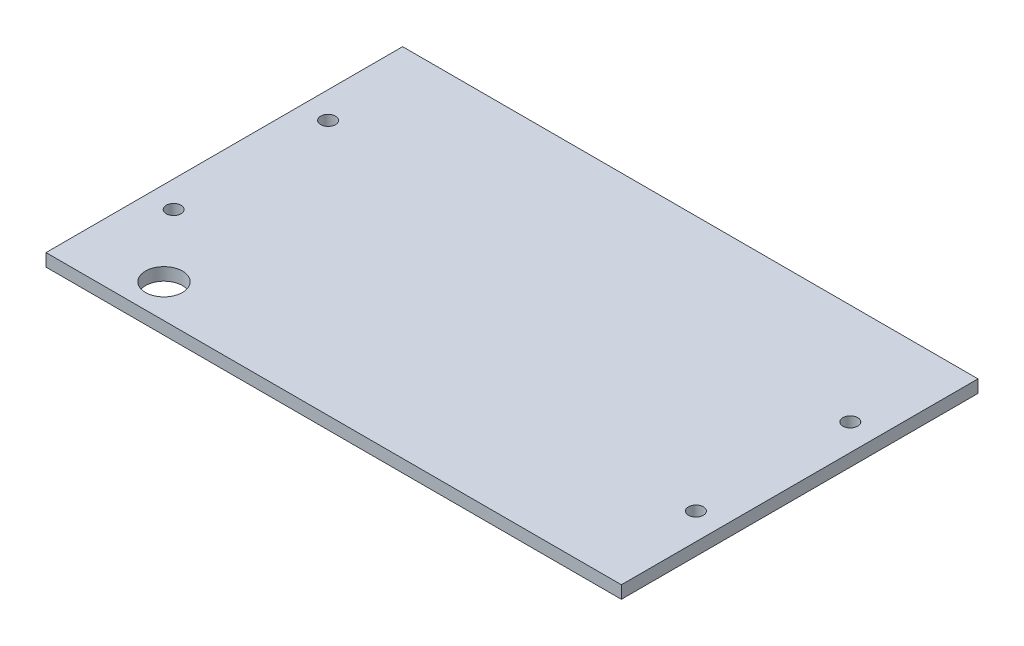
ISO-10303-21;
HEADER;
FILE_DESCRIPTION(('STEP AP214'),'2;1');
FILE_NAME('part.step','',(''),(''),'','','');
FILE_SCHEMA(('AUTOMOTIVE_DESIGN { 1 0 10303 214 1 1 1 1 }'));
ENDSEC;
DATA;
#1=APPLICATION_CONTEXT('core data for automotive mechanical design processes');
#2=APPLICATION_PROTOCOL_DEFINITION('international standard','automotive_design',2000,#1);
#3=PRODUCT_CONTEXT('',#1,'mechanical');
#4=PRODUCT('Part','Part','',(#3));
#5=PRODUCT_RELATED_PRODUCT_CATEGORY('part','',(#4));
#6=PRODUCT_DEFINITION_FORMATION('','',#4);
#7=PRODUCT_DEFINITION_CONTEXT('part definition',#1,'design');
#8=PRODUCT_DEFINITION('design','',#6,#7);
#9=PRODUCT_DEFINITION_SHAPE('','',#8);
#10=(LENGTH_UNIT() NAMED_UNIT(*) SI_UNIT(.MILLI.,.METRE.));
#11=(NAMED_UNIT(*) PLANE_ANGLE_UNIT() SI_UNIT($,.RADIAN.));
#12=(NAMED_UNIT(*) SI_UNIT($,.STERADIAN.) SOLID_ANGLE_UNIT());
#13=UNCERTAINTY_MEASURE_WITH_UNIT(LENGTH_MEASURE(1.E-05),#10,'distance_accuracy_value','');
#14=(GEOMETRIC_REPRESENTATION_CONTEXT(3) GLOBAL_UNCERTAINTY_ASSIGNED_CONTEXT((#13)) GLOBAL_UNIT_ASSIGNED_CONTEXT((#10,
#11,#12)) REPRESENTATION_CONTEXT('',''));
#15=CARTESIAN_POINT('',(0.,0.,0.));
#16=DIRECTION('',(0.,0.,1.));
#17=DIRECTION('',(1.,0.,0.));
#18=AXIS2_PLACEMENT_3D('',#15,#16,#17);
#19=CARTESIAN_POINT('',(0.,4.7625,0.));
#20=DIRECTION('',(0.,-1.,0.));
#21=DIRECTION('',(0.,0.,-1.));
#22=AXIS2_PLACEMENT_3D('',#19,#20,#21);
#23=PLANE('',#22);
#24=DIRECTION('',(0.,0.,1.));
#25=VECTOR('',#24,1.);
#26=CARTESIAN_POINT('',(0.,4.7625,0.));
#27=LINE('',#26,#25);
#28=CARTESIAN_POINT('',(0.,4.7625,-134.366));
#29=VERTEX_POINT('',#28);
#30=CARTESIAN_POINT('',(0.,4.7625,0.));
#31=VERTEX_POINT('',#30);
#32=EDGE_CURVE('E88',#29,#31,#27,.T.);
#33=ORIENTED_EDGE('',*,*,#32,.T.);
#34=DIRECTION('',(1.,0.,0.));
#35=VECTOR('',#34,1.);
#36=CARTESIAN_POINT('',(0.,4.7625,0.));
#37=LINE('',#36,#35);
#38=CARTESIAN_POINT('',(216.78392,4.7625,0.));
#39=VERTEX_POINT('',#38);
#40=EDGE_CURVE('E83',#31,#39,#37,.T.);
#41=ORIENTED_EDGE('',*,*,#40,.T.);
#42=DIRECTION('',(0.,0.,-1.));
#43=VECTOR('',#42,1.);
#44=CARTESIAN_POINT('',(216.78392,4.7625,0.));
#45=LINE('',#44,#43);
#46=CARTESIAN_POINT('',(216.78392,4.7625,-134.366));
#47=VERTEX_POINT('',#46);
#48=EDGE_CURVE('E86',#39,#47,#45,.T.);
#49=ORIENTED_EDGE('',*,*,#48,.T.);
#50=DIRECTION('',(-1.,0.,0.));
#51=VECTOR('',#50,1.);
#52=CARTESIAN_POINT('',(0.,4.7625,-134.366));
#53=LINE('',#52,#51);
#54=EDGE_CURVE('E53',#47,#29,#53,.T.);
#55=ORIENTED_EDGE('',*,*,#54,.T.);
#56=EDGE_LOOP('',(#33,#41,#49,#55));
#57=FACE_BOUND('',#56,.T.);
#58=CARTESIAN_POINT('',(31.75,4.7625,-12.7));
#59=DIRECTION('',(0.,1.,0.));
#60=DIRECTION('',(0.,0.,1.));
#61=AXIS2_PLACEMENT_3D('',#58,#59,#60);
#62=CIRCLE('',#61,6.985);
#63=CARTESIAN_POINT('',(31.75,4.7625,-19.685));
#64=VERTEX_POINT('',#63);
#65=EDGE_CURVE('E103',#64,#64,#62,.T.);
#66=ORIENTED_EDGE('',*,*,#65,.F.);
#67=EDGE_LOOP('',(#66));
#68=FACE_BOUND('',#67,.T.);
#69=CARTESIAN_POINT('',(10.0076,4.7625,-96.266));
#70=DIRECTION('',(0.,1.,0.));
#71=DIRECTION('',(0.,0.,1.));
#72=AXIS2_PLACEMENT_3D('',#69,#70,#71);
#73=CIRCLE('',#72,2.794);
#74=CARTESIAN_POINT('',(10.0076,4.7625,-99.06));
#75=VERTEX_POINT('',#74);
#76=EDGE_CURVE('E118',#75,#75,#73,.T.);
#77=ORIENTED_EDGE('',*,*,#76,.F.);
#78=EDGE_LOOP('',(#77));
#79=FACE_BOUND('',#78,.T.);
#80=CARTESIAN_POINT('',(10.0076,4.7625,-38.1));
#81=DIRECTION('',(0.,1.,0.));
#82=DIRECTION('',(0.,0.,1.));
#83=AXIS2_PLACEMENT_3D('',#80,#81,#82);
#84=CIRCLE('',#83,2.794);
#85=CARTESIAN_POINT('',(10.0076,4.7625,-40.894));
#86=VERTEX_POINT('',#85);
#87=EDGE_CURVE('E124',#86,#86,#84,.T.);
#88=ORIENTED_EDGE('',*,*,#87,.F.);
#89=EDGE_LOOP('',(#88));
#90=FACE_BOUND('',#89,.T.);
#91=CARTESIAN_POINT('',(206.77632,4.7625,-96.266));
#92=DIRECTION('',(0.,1.,0.));
#93=DIRECTION('',(0.,0.,1.));
#94=AXIS2_PLACEMENT_3D('',#91,#92,#93);
#95=CIRCLE('',#94,2.79399999999998);
#96=CARTESIAN_POINT('',(206.77632,4.7625,-99.06));
#97=VERTEX_POINT('',#96);
#98=EDGE_CURVE('E130',#97,#97,#95,.T.);
#99=ORIENTED_EDGE('',*,*,#98,.F.);
#100=EDGE_LOOP('',(#99));
#101=FACE_BOUND('',#100,.T.);
#102=CARTESIAN_POINT('',(206.77632,4.7625,-38.1));
#103=DIRECTION('',(0.,1.,0.));
#104=DIRECTION('',(0.,0.,1.));
#105=AXIS2_PLACEMENT_3D('',#102,#103,#104);
#106=CIRCLE('',#105,2.79399999999998);
#107=CARTESIAN_POINT('',(206.77632,4.7625,-40.894));
#108=VERTEX_POINT('',#107);
#109=EDGE_CURVE('E136',#108,#108,#106,.T.);
#110=ORIENTED_EDGE('',*,*,#109,.F.);
#111=EDGE_LOOP('',(#110));
#112=FACE_BOUND('',#111,.T.);
#113=ADVANCED_FACE('F36',(#57,#68,#79,#90,#101,#112),#23,.F.);
#114=CARTESIAN_POINT('',(0.,0.,0.));
#115=DIRECTION('',(0.,-1.,0.));
#116=DIRECTION('',(0.,0.,-1.));
#117=AXIS2_PLACEMENT_3D('',#114,#115,#116);
#118=PLANE('',#117);
#119=CARTESIAN_POINT('',(206.77632,0.,-96.266));
#120=DIRECTION('',(0.,1.,0.));
#121=DIRECTION('',(0.,0.,1.));
#122=AXIS2_PLACEMENT_3D('',#119,#120,#121);
#123=CIRCLE('',#122,2.79399999999998);
#124=CARTESIAN_POINT('',(206.77632,0.,-99.06));
#125=VERTEX_POINT('',#124);
#126=EDGE_CURVE('E133',#125,#125,#123,.T.);
#127=ORIENTED_EDGE('',*,*,#126,.T.);
#128=EDGE_LOOP('',(#127));
#129=FACE_BOUND('',#128,.T.);
#130=CARTESIAN_POINT('',(10.0076,0.,-96.266));
#131=DIRECTION('',(0.,1.,0.));
#132=DIRECTION('',(0.,0.,1.));
#133=AXIS2_PLACEMENT_3D('',#130,#131,#132);
#134=CIRCLE('',#133,2.794);
#135=CARTESIAN_POINT('',(10.0076,0.,-99.06));
#136=VERTEX_POINT('',#135);
#137=EDGE_CURVE('E121',#136,#136,#134,.T.);
#138=ORIENTED_EDGE('',*,*,#137,.T.);
#139=EDGE_LOOP('',(#138));
#140=FACE_BOUND('',#139,.T.);
#141=DIRECTION('',(0.,0.,1.));
#142=VECTOR('',#141,1.);
#143=CARTESIAN_POINT('',(0.,0.,0.));
#144=LINE('',#143,#142);
#145=CARTESIAN_POINT('',(0.,0.,-134.366));
#146=VERTEX_POINT('',#145);
#147=CARTESIAN_POINT('',(0.,0.,0.));
#148=VERTEX_POINT('',#147);
#149=EDGE_CURVE('E100',#146,#148,#144,.T.);
#150=ORIENTED_EDGE('',*,*,#149,.F.);
#151=DIRECTION('',(-1.,0.,0.));
#152=VECTOR('',#151,1.);
#153=CARTESIAN_POINT('',(0.,0.,-134.366));
#154=LINE('',#153,#152);
#155=CARTESIAN_POINT('',(216.78392,0.,-134.366));
#156=VERTEX_POINT('',#155);
#157=EDGE_CURVE('E76',#156,#146,#154,.T.);
#158=ORIENTED_EDGE('',*,*,#157,.F.);
#159=DIRECTION('',(0.,0.,-1.));
#160=VECTOR('',#159,1.);
#161=CARTESIAN_POINT('',(216.78392,0.,0.));
#162=LINE('',#161,#160);
#163=CARTESIAN_POINT('',(216.78392,0.,0.));
#164=VERTEX_POINT('',#163);
#165=EDGE_CURVE('E70',#164,#156,#162,.T.);
#166=ORIENTED_EDGE('',*,*,#165,.F.);
#167=DIRECTION('',(1.,0.,0.));
#168=VECTOR('',#167,1.);
#169=CARTESIAN_POINT('',(0.,0.,0.));
#170=LINE('',#169,#168);
#171=EDGE_CURVE('E92',#148,#164,#170,.T.);
#172=ORIENTED_EDGE('',*,*,#171,.F.);
#173=EDGE_LOOP('',(#150,#158,#166,#172));
#174=FACE_BOUND('',#173,.T.);
#175=CARTESIAN_POINT('',(31.75,0.,-12.7));
#176=DIRECTION('',(0.,1.,0.));
#177=DIRECTION('',(0.,0.,1.));
#178=AXIS2_PLACEMENT_3D('',#175,#176,#177);
#179=CIRCLE('',#178,6.985);
#180=CARTESIAN_POINT('',(31.75,0.,-19.685));
#181=VERTEX_POINT('',#180);
#182=EDGE_CURVE('E115',#181,#181,#179,.T.);
#183=ORIENTED_EDGE('',*,*,#182,.T.);
#184=EDGE_LOOP('',(#183));
#185=FACE_BOUND('',#184,.T.);
#186=CARTESIAN_POINT('',(10.0076,0.,-38.1));
#187=DIRECTION('',(0.,1.,0.));
#188=DIRECTION('',(0.,0.,1.));
#189=AXIS2_PLACEMENT_3D('',#186,#187,#188);
#190=CIRCLE('',#189,2.794);
#191=CARTESIAN_POINT('',(10.0076,0.,-40.894));
#192=VERTEX_POINT('',#191);
#193=EDGE_CURVE('E127',#192,#192,#190,.T.);
#194=ORIENTED_EDGE('',*,*,#193,.T.);
#195=EDGE_LOOP('',(#194));
#196=FACE_BOUND('',#195,.T.);
#197=CARTESIAN_POINT('',(206.77632,0.,-38.1));
#198=DIRECTION('',(0.,1.,0.));
#199=DIRECTION('',(0.,0.,1.));
#200=AXIS2_PLACEMENT_3D('',#197,#198,#199);
#201=CIRCLE('',#200,2.79399999999998);
#202=CARTESIAN_POINT('',(206.77632,0.,-40.894));
#203=VERTEX_POINT('',#202);
#204=EDGE_CURVE('E139',#203,#203,#201,.T.);
#205=ORIENTED_EDGE('',*,*,#204,.T.);
#206=EDGE_LOOP('',(#205));
#207=FACE_BOUND('',#206,.T.);
#208=ADVANCED_FACE('F111',(#129,#140,#174,#185,#196,#207),#118,.T.);
#209=CARTESIAN_POINT('',(0.,4.7625,0.));
#210=DIRECTION('',(1.,0.,0.));
#211=DIRECTION('',(0.,0.,-1.));
#212=AXIS2_PLACEMENT_3D('',#209,#210,#211);
#213=PLANE('',#212);
#214=ORIENTED_EDGE('',*,*,#149,.T.);
#215=DIRECTION('',(0.,-1.,0.));
#216=VECTOR('',#215,1.);
#217=CARTESIAN_POINT('',(0.,4.7625,0.));
#218=LINE('',#217,#216);
#219=EDGE_CURVE('E11',#31,#148,#218,.T.);
#220=ORIENTED_EDGE('',*,*,#219,.F.);
#221=ORIENTED_EDGE('',*,*,#32,.F.);
#222=DIRECTION('',(0.,-1.,0.));
#223=VECTOR('',#222,1.);
#224=CARTESIAN_POINT('',(0.,4.7625,-134.366));
#225=LINE('',#224,#223);
#226=EDGE_CURVE('E96',#29,#146,#225,.T.);
#227=ORIENTED_EDGE('',*,*,#226,.T.);
#228=EDGE_LOOP('',(#214,#220,#221,#227));
#229=FACE_BOUND('',#228,.T.);
#230=ADVANCED_FACE('F38',(#229),#213,.F.);
#231=CARTESIAN_POINT('',(0.,4.7625,0.));
#232=DIRECTION('',(0.,0.,-1.));
#233=DIRECTION('',(-1.,0.,0.));
#234=AXIS2_PLACEMENT_3D('',#231,#232,#233);
#235=PLANE('',#234);
#236=ORIENTED_EDGE('',*,*,#171,.T.);
#237=DIRECTION('',(0.,-1.,0.));
#238=VECTOR('',#237,1.);
#239=CARTESIAN_POINT('',(216.78392,4.7625,0.));
#240=LINE('',#239,#238);
#241=EDGE_CURVE('E45',#39,#164,#240,.T.);
#242=ORIENTED_EDGE('',*,*,#241,.F.);
#243=ORIENTED_EDGE('',*,*,#40,.F.);
#244=ORIENTED_EDGE('',*,*,#219,.T.);
#245=EDGE_LOOP('',(#236,#242,#243,#244));
#246=FACE_BOUND('',#245,.T.);
#247=ADVANCED_FACE('F91',(#246),#235,.F.);
#248=CARTESIAN_POINT('',(216.78392,4.7625,0.));
#249=DIRECTION('',(-1.,0.,0.));
#250=DIRECTION('',(0.,0.,1.));
#251=AXIS2_PLACEMENT_3D('',#248,#249,#250);
#252=PLANE('',#251);
#253=ORIENTED_EDGE('',*,*,#165,.T.);
#254=DIRECTION('',(0.,-1.,0.));
#255=VECTOR('',#254,1.);
#256=CARTESIAN_POINT('',(216.78392,4.7625,-134.366));
#257=LINE('',#256,#255);
#258=EDGE_CURVE('E93',#47,#156,#257,.T.);
#259=ORIENTED_EDGE('',*,*,#258,.F.);
#260=ORIENTED_EDGE('',*,*,#48,.F.);
#261=ORIENTED_EDGE('',*,*,#241,.T.);
#262=EDGE_LOOP('',(#253,#259,#260,#261));
#263=FACE_BOUND('',#262,.T.);
#264=ADVANCED_FACE('F94',(#263),#252,.F.);
#265=CARTESIAN_POINT('',(0.,4.7625,-134.366));
#266=DIRECTION('',(0.,0.,1.));
#267=DIRECTION('',(1.,0.,0.));
#268=AXIS2_PLACEMENT_3D('',#265,#266,#267);
#269=PLANE('',#268);
#270=ORIENTED_EDGE('',*,*,#157,.T.);
#271=ORIENTED_EDGE('',*,*,#226,.F.);
#272=ORIENTED_EDGE('',*,*,#54,.F.);
#273=ORIENTED_EDGE('',*,*,#258,.T.);
#274=EDGE_LOOP('',(#270,#271,#272,#273));
#275=FACE_BOUND('',#274,.T.);
#276=ADVANCED_FACE('F108',(#275),#269,.F.);
#277=CARTESIAN_POINT('',(31.75,4.7625,-12.7));
#278=DIRECTION('',(0.,-1.,0.));
#279=DIRECTION('',(0.,0.,-1.));
#280=AXIS2_PLACEMENT_3D('',#277,#278,#279);
#281=CYLINDRICAL_SURFACE('',#280,6.985);
#282=CARTESIAN_POINT('',(31.75,4.7625,-19.685));
#283=CARTESIAN_POINT('',(31.75,4.712890625,-19.685));
#284=CARTESIAN_POINT('',(31.75,4.66328125,-19.685));
#285=CARTESIAN_POINT('',(31.75,4.5640625,-19.685));
#286=CARTESIAN_POINT('',(31.75,4.514453125,-19.685));
#287=CARTESIAN_POINT('',(31.75,4.415234375,-19.685));
#288=CARTESIAN_POINT('',(31.75,4.365625,-19.685));
#289=CARTESIAN_POINT('',(31.75,4.26640625,-19.685));
#290=CARTESIAN_POINT('',(31.75,4.216796875,-19.685));
#291=CARTESIAN_POINT('',(31.75,4.117578125,-19.685));
#292=CARTESIAN_POINT('',(31.75,4.06796875,-19.685));
#293=CARTESIAN_POINT('',(31.75,3.96875,-19.685));
#294=CARTESIAN_POINT('',(31.75,3.919140625,-19.685));
#295=CARTESIAN_POINT('',(31.75,3.819921875,-19.685));
#296=CARTESIAN_POINT('',(31.75,3.7703125,-19.685));
#297=CARTESIAN_POINT('',(31.75,3.67109375,-19.685));
#298=CARTESIAN_POINT('',(31.75,3.621484375,-19.685));
#299=CARTESIAN_POINT('',(31.75,3.522265625,-19.685));
#300=CARTESIAN_POINT('',(31.75,3.47265625,-19.685));
#301=CARTESIAN_POINT('',(31.75,3.3734375,-19.685));
#302=CARTESIAN_POINT('',(31.75,3.323828125,-19.685));
#303=CARTESIAN_POINT('',(31.75,3.224609375,-19.685));
#304=CARTESIAN_POINT('',(31.75,3.175,-19.685));
#305=CARTESIAN_POINT('',(31.75,3.07578125,-19.685));
#306=CARTESIAN_POINT('',(31.75,3.026171875,-19.685));
#307=CARTESIAN_POINT('',(31.75,2.926953125,-19.685));
#308=CARTESIAN_POINT('',(31.75,2.87734375,-19.685));
#309=CARTESIAN_POINT('',(31.75,2.778125,-19.685));
#310=CARTESIAN_POINT('',(31.75,2.728515625,-19.685));
#311=CARTESIAN_POINT('',(31.75,2.629296875,-19.685));
#312=CARTESIAN_POINT('',(31.75,2.5796875,-19.685));
#313=CARTESIAN_POINT('',(31.75,2.48046875,-19.685));
#314=CARTESIAN_POINT('',(31.75,2.430859375,-19.685));
#315=CARTESIAN_POINT('',(31.75,2.331640625,-19.685));
#316=CARTESIAN_POINT('',(31.75,2.28203125,-19.685));
#317=CARTESIAN_POINT('',(31.75,2.1828125,-19.685));
#318=CARTESIAN_POINT('',(31.75,2.133203125,-19.685));
#319=CARTESIAN_POINT('',(31.75,2.033984375,-19.685));
#320=CARTESIAN_POINT('',(31.75,1.984375,-19.685));
#321=CARTESIAN_POINT('',(31.75,1.88515625,-19.685));
#322=CARTESIAN_POINT('',(31.75,1.835546875,-19.685));
#323=CARTESIAN_POINT('',(31.75,1.736328125,-19.685));
#324=CARTESIAN_POINT('',(31.75,1.68671875,-19.685));
#325=CARTESIAN_POINT('',(31.75,1.5875,-19.685));
#326=CARTESIAN_POINT('',(31.75,1.537890625,-19.685));
#327=CARTESIAN_POINT('',(31.75,1.438671875,-19.685));
#328=CARTESIAN_POINT('',(31.75,1.3890625,-19.685));
#329=CARTESIAN_POINT('',(31.75,1.28984375,-19.685));
#330=CARTESIAN_POINT('',(31.75,1.240234375,-19.685));
#331=CARTESIAN_POINT('',(31.75,1.141015625,-19.685));
#332=CARTESIAN_POINT('',(31.75,1.09140625,-19.685));
#333=CARTESIAN_POINT('',(31.75,0.9921875,-19.685));
#334=CARTESIAN_POINT('',(31.75,0.942578125,-19.685));
#335=CARTESIAN_POINT('',(31.75,0.843359375,-19.685));
#336=CARTESIAN_POINT('',(31.75,0.79375,-19.685));
#337=CARTESIAN_POINT('',(31.75,0.69453125,-19.685));
#338=CARTESIAN_POINT('',(31.75,0.644921875,-19.685));
#339=CARTESIAN_POINT('',(31.75,0.545703125,-19.685));
#340=CARTESIAN_POINT('',(31.75,0.49609375,-19.685));
#341=CARTESIAN_POINT('',(31.75,0.396875,-19.685));
#342=CARTESIAN_POINT('',(31.75,0.347265625,-19.685));
#343=CARTESIAN_POINT('',(31.75,0.248046875,-19.685));
#344=CARTESIAN_POINT('',(31.75,0.1984375,-19.685));
#345=CARTESIAN_POINT('',(31.75,0.09921875,-19.685));
#346=CARTESIAN_POINT('',(31.75,0.049609375,-19.685));
#347=CARTESIAN_POINT('',(31.75,0.,-19.685));
#348=B_SPLINE_CURVE_WITH_KNOTS('',3,(#282,#283,#284,#285,#286,#287,#288,#289,#290,#291,#292,
#293,#294,#295,#296,#297,#298,#299,#300,#301,#302,#303,#304,#305,#306,#307,#308,#309,#310,#311,
#312,#313,#314,#315,#316,#317,#318,#319,#320,#321,#322,#323,#324,#325,#326,#327,#328,#329,#330,
#331,#332,#333,#334,#335,#336,#337,#338,#339,#340,#341,#342,#343,#344,#345,#346,#347),
.UNSPECIFIED.,.F.,.F.,(4,2,2,2,2,2,2,2,2,2,2,2,2,2,2,2,2,2,2,2,2,2,2,2,2,2,2,2,2,2,2,2,4),(0.,
0.148828124999999,0.297656249999999,0.446484374999999,0.595312499999999,0.744140625,0.89296875,
1.041796875,1.190625,1.339453125,1.48828125,1.637109375,1.7859375,1.934765625,2.08359375,
2.232421875,2.38125,2.530078125,2.67890625,2.827734375,2.9765625,3.125390625,3.27421875,
3.423046875,3.571875,3.720703125,3.86953125,4.018359375,4.1671875,4.316015625,4.46484375,
4.613671875,4.7625),.UNSPECIFIED.);
#349=EDGE_CURVE('BSEAM156',#64,#181,#348,.T.);
#350=ORIENTED_EDGE('',*,*,#65,.T.);
#351=ORIENTED_EDGE('',*,*,#182,.F.);
#352=ORIENTED_EDGE('',*,*,#349,.T.);
#353=ORIENTED_EDGE('',*,*,#349,.F.);
#354=EDGE_LOOP('',(#350,#352,#351,#353));
#355=FACE_BOUND('',#354,.T.);
#356=ADVANCED_FACE('F156',(#355),#281,.F.);
#357=CARTESIAN_POINT('',(10.0076,4.7625,-96.266));
#358=DIRECTION('',(0.,-1.,0.));
#359=DIRECTION('',(0.,0.,-1.));
#360=AXIS2_PLACEMENT_3D('',#357,#358,#359);
#361=CYLINDRICAL_SURFACE('',#360,2.794);
#362=CARTESIAN_POINT('',(10.0076,4.7625,-99.06));
#363=CARTESIAN_POINT('',(10.0076,4.712890625,-99.06));
#364=CARTESIAN_POINT('',(10.0076,4.66328125,-99.06));
#365=CARTESIAN_POINT('',(10.0076,4.5640625,-99.06));
#366=CARTESIAN_POINT('',(10.0076,4.514453125,-99.06));
#367=CARTESIAN_POINT('',(10.0076,4.415234375,-99.06));
#368=CARTESIAN_POINT('',(10.0076,4.365625,-99.06));
#369=CARTESIAN_POINT('',(10.0076,4.26640625,-99.06));
#370=CARTESIAN_POINT('',(10.0076,4.216796875,-99.06));
#371=CARTESIAN_POINT('',(10.0076,4.117578125,-99.06));
#372=CARTESIAN_POINT('',(10.0076,4.06796875,-99.06));
#373=CARTESIAN_POINT('',(10.0076,3.96875,-99.06));
#374=CARTESIAN_POINT('',(10.0076,3.919140625,-99.06));
#375=CARTESIAN_POINT('',(10.0076,3.819921875,-99.06));
#376=CARTESIAN_POINT('',(10.0076,3.7703125,-99.06));
#377=CARTESIAN_POINT('',(10.0076,3.67109375,-99.06));
#378=CARTESIAN_POINT('',(10.0076,3.621484375,-99.06));
#379=CARTESIAN_POINT('',(10.0076,3.522265625,-99.06));
#380=CARTESIAN_POINT('',(10.0076,3.47265625,-99.06));
#381=CARTESIAN_POINT('',(10.0076,3.3734375,-99.06));
#382=CARTESIAN_POINT('',(10.0076,3.323828125,-99.06));
#383=CARTESIAN_POINT('',(10.0076,3.224609375,-99.06));
#384=CARTESIAN_POINT('',(10.0076,3.175,-99.06));
#385=CARTESIAN_POINT('',(10.0076,3.07578125,-99.06));
#386=CARTESIAN_POINT('',(10.0076,3.026171875,-99.06));
#387=CARTESIAN_POINT('',(10.0076,2.926953125,-99.06));
#388=CARTESIAN_POINT('',(10.0076,2.87734375,-99.06));
#389=CARTESIAN_POINT('',(10.0076,2.778125,-99.06));
#390=CARTESIAN_POINT('',(10.0076,2.728515625,-99.06));
#391=CARTESIAN_POINT('',(10.0076,2.629296875,-99.06));
#392=CARTESIAN_POINT('',(10.0076,2.5796875,-99.06));
#393=CARTESIAN_POINT('',(10.0076,2.48046875,-99.06));
#394=CARTESIAN_POINT('',(10.0076,2.430859375,-99.06));
#395=CARTESIAN_POINT('',(10.0076,2.331640625,-99.06));
#396=CARTESIAN_POINT('',(10.0076,2.28203125,-99.06));
#397=CARTESIAN_POINT('',(10.0076,2.1828125,-99.06));
#398=CARTESIAN_POINT('',(10.0076,2.133203125,-99.06));
#399=CARTESIAN_POINT('',(10.0076,2.033984375,-99.06));
#400=CARTESIAN_POINT('',(10.0076,1.984375,-99.06));
#401=CARTESIAN_POINT('',(10.0076,1.88515625,-99.06));
#402=CARTESIAN_POINT('',(10.0076,1.835546875,-99.06));
#403=CARTESIAN_POINT('',(10.0076,1.736328125,-99.06));
#404=CARTESIAN_POINT('',(10.0076,1.68671875,-99.06));
#405=CARTESIAN_POINT('',(10.0076,1.5875,-99.06));
#406=CARTESIAN_POINT('',(10.0076,1.537890625,-99.06));
#407=CARTESIAN_POINT('',(10.0076,1.438671875,-99.06));
#408=CARTESIAN_POINT('',(10.0076,1.3890625,-99.06));
#409=CARTESIAN_POINT('',(10.0076,1.28984375,-99.06));
#410=CARTESIAN_POINT('',(10.0076,1.240234375,-99.06));
#411=CARTESIAN_POINT('',(10.0076,1.141015625,-99.06));
#412=CARTESIAN_POINT('',(10.0076,1.09140625,-99.06));
#413=CARTESIAN_POINT('',(10.0076,0.9921875,-99.06));
#414=CARTESIAN_POINT('',(10.0076,0.942578125,-99.06));
#415=CARTESIAN_POINT('',(10.0076,0.843359375,-99.06));
#416=CARTESIAN_POINT('',(10.0076,0.79375,-99.06));
#417=CARTESIAN_POINT('',(10.0076,0.69453125,-99.06));
#418=CARTESIAN_POINT('',(10.0076,0.644921875,-99.06));
#419=CARTESIAN_POINT('',(10.0076,0.545703125,-99.06));
#420=CARTESIAN_POINT('',(10.0076,0.49609375,-99.06));
#421=CARTESIAN_POINT('',(10.0076,0.396875,-99.06));
#422=CARTESIAN_POINT('',(10.0076,0.347265625,-99.06));
#423=CARTESIAN_POINT('',(10.0076,0.248046875,-99.06));
#424=CARTESIAN_POINT('',(10.0076,0.1984375,-99.06));
#425=CARTESIAN_POINT('',(10.0076,0.09921875,-99.06));
#426=CARTESIAN_POINT('',(10.0076,0.049609375,-99.06));
#427=CARTESIAN_POINT('',(10.0076,0.,-99.06));
#428=B_SPLINE_CURVE_WITH_KNOTS('',3,(#362,#363,#364,#365,#366,#367,#368,#369,#370,#371,#372,
#373,#374,#375,#376,#377,#378,#379,#380,#381,#382,#383,#384,#385,#386,#387,#388,#389,#390,#391,
#392,#393,#394,#395,#396,#397,#398,#399,#400,#401,#402,#403,#404,#405,#406,#407,#408,#409,#410,
#411,#412,#413,#414,#415,#416,#417,#418,#419,#420,#421,#422,#423,#424,#425,#426,#427),
.UNSPECIFIED.,.F.,.F.,(4,2,2,2,2,2,2,2,2,2,2,2,2,2,2,2,2,2,2,2,2,2,2,2,2,2,2,2,2,2,2,2,4),(0.,
0.148828124999999,0.297656249999999,0.446484374999999,0.595312499999999,0.744140625,0.89296875,
1.041796875,1.190625,1.339453125,1.48828125,1.637109375,1.7859375,1.934765625,2.08359375,
2.232421875,2.38125,2.530078125,2.67890625,2.827734375,2.9765625,3.125390625,3.27421875,
3.423046875,3.571875,3.720703125,3.86953125,4.018359375,4.1671875,4.316015625,4.46484375,
4.613671875,4.7625),.UNSPECIFIED.);
#429=EDGE_CURVE('BSEAM210',#75,#136,#428,.T.);
#430=ORIENTED_EDGE('',*,*,#76,.T.);
#431=ORIENTED_EDGE('',*,*,#137,.F.);
#432=ORIENTED_EDGE('',*,*,#429,.T.);
#433=ORIENTED_EDGE('',*,*,#429,.F.);
#434=EDGE_LOOP('',(#430,#432,#431,#433));
#435=FACE_BOUND('',#434,.T.);
#436=ADVANCED_FACE('F210',(#435),#361,.F.);
#437=CARTESIAN_POINT('',(10.0076,4.7625,-38.1));
#438=DIRECTION('',(0.,-1.,0.));
#439=DIRECTION('',(0.,0.,-1.));
#440=AXIS2_PLACEMENT_3D('',#437,#438,#439);
#441=CYLINDRICAL_SURFACE('',#440,2.794);
#442=CARTESIAN_POINT('',(10.0076,4.7625,-40.894));
#443=CARTESIAN_POINT('',(10.0076,4.712890625,-40.894));
#444=CARTESIAN_POINT('',(10.0076,4.66328125,-40.894));
#445=CARTESIAN_POINT('',(10.0076,4.5640625,-40.894));
#446=CARTESIAN_POINT('',(10.0076,4.514453125,-40.894));
#447=CARTESIAN_POINT('',(10.0076,4.415234375,-40.894));
#448=CARTESIAN_POINT('',(10.0076,4.365625,-40.894));
#449=CARTESIAN_POINT('',(10.0076,4.26640625,-40.894));
#450=CARTESIAN_POINT('',(10.0076,4.216796875,-40.894));
#451=CARTESIAN_POINT('',(10.0076,4.117578125,-40.894));
#452=CARTESIAN_POINT('',(10.0076,4.06796875,-40.894));
#453=CARTESIAN_POINT('',(10.0076,3.96875,-40.894));
#454=CARTESIAN_POINT('',(10.0076,3.919140625,-40.894));
#455=CARTESIAN_POINT('',(10.0076,3.819921875,-40.894));
#456=CARTESIAN_POINT('',(10.0076,3.7703125,-40.894));
#457=CARTESIAN_POINT('',(10.0076,3.67109375,-40.894));
#458=CARTESIAN_POINT('',(10.0076,3.621484375,-40.894));
#459=CARTESIAN_POINT('',(10.0076,3.522265625,-40.894));
#460=CARTESIAN_POINT('',(10.0076,3.47265625,-40.894));
#461=CARTESIAN_POINT('',(10.0076,3.3734375,-40.894));
#462=CARTESIAN_POINT('',(10.0076,3.323828125,-40.894));
#463=CARTESIAN_POINT('',(10.0076,3.224609375,-40.894));
#464=CARTESIAN_POINT('',(10.0076,3.175,-40.894));
#465=CARTESIAN_POINT('',(10.0076,3.07578125,-40.894));
#466=CARTESIAN_POINT('',(10.0076,3.026171875,-40.894));
#467=CARTESIAN_POINT('',(10.0076,2.926953125,-40.894));
#468=CARTESIAN_POINT('',(10.0076,2.87734375,-40.894));
#469=CARTESIAN_POINT('',(10.0076,2.778125,-40.894));
#470=CARTESIAN_POINT('',(10.0076,2.728515625,-40.894));
#471=CARTESIAN_POINT('',(10.0076,2.629296875,-40.894));
#472=CARTESIAN_POINT('',(10.0076,2.5796875,-40.894));
#473=CARTESIAN_POINT('',(10.0076,2.48046875,-40.894));
#474=CARTESIAN_POINT('',(10.0076,2.430859375,-40.894));
#475=CARTESIAN_POINT('',(10.0076,2.331640625,-40.894));
#476=CARTESIAN_POINT('',(10.0076,2.28203125,-40.894));
#477=CARTESIAN_POINT('',(10.0076,2.1828125,-40.894));
#478=CARTESIAN_POINT('',(10.0076,2.133203125,-40.894));
#479=CARTESIAN_POINT('',(10.0076,2.033984375,-40.894));
#480=CARTESIAN_POINT('',(10.0076,1.984375,-40.894));
#481=CARTESIAN_POINT('',(10.0076,1.88515625,-40.894));
#482=CARTESIAN_POINT('',(10.0076,1.835546875,-40.894));
#483=CARTESIAN_POINT('',(10.0076,1.736328125,-40.894));
#484=CARTESIAN_POINT('',(10.0076,1.68671875,-40.894));
#485=CARTESIAN_POINT('',(10.0076,1.5875,-40.894));
#486=CARTESIAN_POINT('',(10.0076,1.537890625,-40.894));
#487=CARTESIAN_POINT('',(10.0076,1.438671875,-40.894));
#488=CARTESIAN_POINT('',(10.0076,1.3890625,-40.894));
#489=CARTESIAN_POINT('',(10.0076,1.28984375,-40.894));
#490=CARTESIAN_POINT('',(10.0076,1.240234375,-40.894));
#491=CARTESIAN_POINT('',(10.0076,1.141015625,-40.894));
#492=CARTESIAN_POINT('',(10.0076,1.09140625,-40.894));
#493=CARTESIAN_POINT('',(10.0076,0.9921875,-40.894));
#494=CARTESIAN_POINT('',(10.0076,0.942578125,-40.894));
#495=CARTESIAN_POINT('',(10.0076,0.843359375,-40.894));
#496=CARTESIAN_POINT('',(10.0076,0.79375,-40.894));
#497=CARTESIAN_POINT('',(10.0076,0.69453125,-40.894));
#498=CARTESIAN_POINT('',(10.0076,0.644921875,-40.894));
#499=CARTESIAN_POINT('',(10.0076,0.545703125,-40.894));
#500=CARTESIAN_POINT('',(10.0076,0.49609375,-40.894));
#501=CARTESIAN_POINT('',(10.0076,0.396875,-40.894));
#502=CARTESIAN_POINT('',(10.0076,0.347265625,-40.894));
#503=CARTESIAN_POINT('',(10.0076,0.248046875,-40.894));
#504=CARTESIAN_POINT('',(10.0076,0.1984375,-40.894));
#505=CARTESIAN_POINT('',(10.0076,0.09921875,-40.894));
#506=CARTESIAN_POINT('',(10.0076,0.049609375,-40.894));
#507=CARTESIAN_POINT('',(10.0076,0.,-40.894));
#508=B_SPLINE_CURVE_WITH_KNOTS('',3,(#442,#443,#444,#445,#446,#447,#448,#449,#450,#451,#452,
#453,#454,#455,#456,#457,#458,#459,#460,#461,#462,#463,#464,#465,#466,#467,#468,#469,#470,#471,
#472,#473,#474,#475,#476,#477,#478,#479,#480,#481,#482,#483,#484,#485,#486,#487,#488,#489,#490,
#491,#492,#493,#494,#495,#496,#497,#498,#499,#500,#501,#502,#503,#504,#505,#506,#507),
.UNSPECIFIED.,.F.,.F.,(4,2,2,2,2,2,2,2,2,2,2,2,2,2,2,2,2,2,2,2,2,2,2,2,2,2,2,2,2,2,2,2,4),(0.,
0.148828124999999,0.297656249999999,0.446484374999999,0.595312499999999,0.744140625,0.89296875,
1.041796875,1.190625,1.339453125,1.48828125,1.637109375,1.7859375,1.934765625,2.08359375,
2.232421875,2.38125,2.530078125,2.67890625,2.827734375,2.9765625,3.125390625,3.27421875,
3.423046875,3.571875,3.720703125,3.86953125,4.018359375,4.1671875,4.316015625,4.46484375,
4.613671875,4.7625),.UNSPECIFIED.);
#509=EDGE_CURVE('BSEAM219',#86,#192,#508,.T.);
#510=ORIENTED_EDGE('',*,*,#87,.T.);
#511=ORIENTED_EDGE('',*,*,#193,.F.);
#512=ORIENTED_EDGE('',*,*,#509,.T.);
#513=ORIENTED_EDGE('',*,*,#509,.F.);
#514=EDGE_LOOP('',(#510,#512,#511,#513));
#515=FACE_BOUND('',#514,.T.);
#516=ADVANCED_FACE('F219',(#515),#441,.F.);
#517=CARTESIAN_POINT('',(206.77632,4.7625,-96.266));
#518=DIRECTION('',(0.,-1.,0.));
#519=DIRECTION('',(0.,0.,-1.));
#520=AXIS2_PLACEMENT_3D('',#517,#518,#519);
#521=CYLINDRICAL_SURFACE('',#520,2.79399999999998);
#522=CARTESIAN_POINT('',(206.77632,4.7625,-99.06));
#523=CARTESIAN_POINT('',(206.77632,4.712890625,-99.06));
#524=CARTESIAN_POINT('',(206.77632,4.66328125,-99.06));
#525=CARTESIAN_POINT('',(206.77632,4.5640625,-99.06));
#526=CARTESIAN_POINT('',(206.77632,4.514453125,-99.06));
#527=CARTESIAN_POINT('',(206.77632,4.415234375,-99.06));
#528=CARTESIAN_POINT('',(206.77632,4.365625,-99.06));
#529=CARTESIAN_POINT('',(206.77632,4.26640625,-99.06));
#530=CARTESIAN_POINT('',(206.77632,4.216796875,-99.06));
#531=CARTESIAN_POINT('',(206.77632,4.117578125,-99.06));
#532=CARTESIAN_POINT('',(206.77632,4.06796875,-99.06));
#533=CARTESIAN_POINT('',(206.77632,3.96875,-99.06));
#534=CARTESIAN_POINT('',(206.77632,3.919140625,-99.06));
#535=CARTESIAN_POINT('',(206.77632,3.819921875,-99.06));
#536=CARTESIAN_POINT('',(206.77632,3.7703125,-99.06));
#537=CARTESIAN_POINT('',(206.77632,3.67109375,-99.06));
#538=CARTESIAN_POINT('',(206.77632,3.621484375,-99.06));
#539=CARTESIAN_POINT('',(206.77632,3.522265625,-99.06));
#540=CARTESIAN_POINT('',(206.77632,3.47265625,-99.06));
#541=CARTESIAN_POINT('',(206.77632,3.3734375,-99.06));
#542=CARTESIAN_POINT('',(206.77632,3.323828125,-99.06));
#543=CARTESIAN_POINT('',(206.77632,3.224609375,-99.06));
#544=CARTESIAN_POINT('',(206.77632,3.175,-99.06));
#545=CARTESIAN_POINT('',(206.77632,3.07578125,-99.06));
#546=CARTESIAN_POINT('',(206.77632,3.026171875,-99.06));
#547=CARTESIAN_POINT('',(206.77632,2.926953125,-99.06));
#548=CARTESIAN_POINT('',(206.77632,2.87734375,-99.06));
#549=CARTESIAN_POINT('',(206.77632,2.778125,-99.06));
#550=CARTESIAN_POINT('',(206.77632,2.728515625,-99.06));
#551=CARTESIAN_POINT('',(206.77632,2.629296875,-99.06));
#552=CARTESIAN_POINT('',(206.77632,2.5796875,-99.06));
#553=CARTESIAN_POINT('',(206.77632,2.48046875,-99.06));
#554=CARTESIAN_POINT('',(206.77632,2.430859375,-99.06));
#555=CARTESIAN_POINT('',(206.77632,2.331640625,-99.06));
#556=CARTESIAN_POINT('',(206.77632,2.28203125,-99.06));
#557=CARTESIAN_POINT('',(206.77632,2.1828125,-99.06));
#558=CARTESIAN_POINT('',(206.77632,2.133203125,-99.06));
#559=CARTESIAN_POINT('',(206.77632,2.033984375,-99.06));
#560=CARTESIAN_POINT('',(206.77632,1.984375,-99.06));
#561=CARTESIAN_POINT('',(206.77632,1.88515625,-99.06));
#562=CARTESIAN_POINT('',(206.77632,1.835546875,-99.06));
#563=CARTESIAN_POINT('',(206.77632,1.736328125,-99.06));
#564=CARTESIAN_POINT('',(206.77632,1.68671875,-99.06));
#565=CARTESIAN_POINT('',(206.77632,1.5875,-99.06));
#566=CARTESIAN_POINT('',(206.77632,1.537890625,-99.06));
#567=CARTESIAN_POINT('',(206.77632,1.438671875,-99.06));
#568=CARTESIAN_POINT('',(206.77632,1.3890625,-99.06));
#569=CARTESIAN_POINT('',(206.77632,1.28984375,-99.06));
#570=CARTESIAN_POINT('',(206.77632,1.240234375,-99.06));
#571=CARTESIAN_POINT('',(206.77632,1.141015625,-99.06));
#572=CARTESIAN_POINT('',(206.77632,1.09140625,-99.06));
#573=CARTESIAN_POINT('',(206.77632,0.9921875,-99.06));
#574=CARTESIAN_POINT('',(206.77632,0.942578125,-99.06));
#575=CARTESIAN_POINT('',(206.77632,0.843359375,-99.06));
#576=CARTESIAN_POINT('',(206.77632,0.79375,-99.06));
#577=CARTESIAN_POINT('',(206.77632,0.69453125,-99.06));
#578=CARTESIAN_POINT('',(206.77632,0.644921875,-99.06));
#579=CARTESIAN_POINT('',(206.77632,0.545703125,-99.06));
#580=CARTESIAN_POINT('',(206.77632,0.49609375,-99.06));
#581=CARTESIAN_POINT('',(206.77632,0.396875,-99.06));
#582=CARTESIAN_POINT('',(206.77632,0.347265625,-99.06));
#583=CARTESIAN_POINT('',(206.77632,0.248046875,-99.06));
#584=CARTESIAN_POINT('',(206.77632,0.1984375,-99.06));
#585=CARTESIAN_POINT('',(206.77632,0.09921875,-99.06));
#586=CARTESIAN_POINT('',(206.77632,0.049609375,-99.06));
#587=CARTESIAN_POINT('',(206.77632,0.,-99.06));
#588=B_SPLINE_CURVE_WITH_KNOTS('',3,(#522,#523,#524,#525,#526,#527,#528,#529,#530,#531,#532,
#533,#534,#535,#536,#537,#538,#539,#540,#541,#542,#543,#544,#545,#546,#547,#548,#549,#550,#551,
#552,#553,#554,#555,#556,#557,#558,#559,#560,#561,#562,#563,#564,#565,#566,#567,#568,#569,#570,
#571,#572,#573,#574,#575,#576,#577,#578,#579,#580,#581,#582,#583,#584,#585,#586,#587),
.UNSPECIFIED.,.F.,.F.,(4,2,2,2,2,2,2,2,2,2,2,2,2,2,2,2,2,2,2,2,2,2,2,2,2,2,2,2,2,2,2,2,4),(0.,
0.148828124999999,0.297656249999999,0.446484374999999,0.595312499999999,0.744140625,0.89296875,
1.041796875,1.190625,1.339453125,1.48828125,1.637109375,1.7859375,1.934765625,2.08359375,
2.232421875,2.38125,2.530078125,2.67890625,2.827734375,2.9765625,3.125390625,3.27421875,
3.423046875,3.571875,3.720703125,3.86953125,4.018359375,4.1671875,4.316015625,4.46484375,
4.613671875,4.7625),.UNSPECIFIED.);
#589=EDGE_CURVE('BSEAM228',#97,#125,#588,.T.);
#590=ORIENTED_EDGE('',*,*,#98,.T.);
#591=ORIENTED_EDGE('',*,*,#126,.F.);
#592=ORIENTED_EDGE('',*,*,#589,.T.);
#593=ORIENTED_EDGE('',*,*,#589,.F.);
#594=EDGE_LOOP('',(#590,#592,#591,#593));
#595=FACE_BOUND('',#594,.T.);
#596=ADVANCED_FACE('F228',(#595),#521,.F.);
#597=CARTESIAN_POINT('',(206.77632,4.7625,-38.1));
#598=DIRECTION('',(0.,-1.,0.));
#599=DIRECTION('',(0.,0.,-1.));
#600=AXIS2_PLACEMENT_3D('',#597,#598,#599);
#601=CYLINDRICAL_SURFACE('',#600,2.79399999999998);
#602=CARTESIAN_POINT('',(206.77632,4.7625,-40.894));
#603=CARTESIAN_POINT('',(206.77632,4.712890625,-40.894));
#604=CARTESIAN_POINT('',(206.77632,4.66328125,-40.894));
#605=CARTESIAN_POINT('',(206.77632,4.5640625,-40.894));
#606=CARTESIAN_POINT('',(206.77632,4.514453125,-40.894));
#607=CARTESIAN_POINT('',(206.77632,4.415234375,-40.894));
#608=CARTESIAN_POINT('',(206.77632,4.365625,-40.894));
#609=CARTESIAN_POINT('',(206.77632,4.26640625,-40.894));
#610=CARTESIAN_POINT('',(206.77632,4.216796875,-40.894));
#611=CARTESIAN_POINT('',(206.77632,4.117578125,-40.894));
#612=CARTESIAN_POINT('',(206.77632,4.06796875,-40.894));
#613=CARTESIAN_POINT('',(206.77632,3.96875,-40.894));
#614=CARTESIAN_POINT('',(206.77632,3.919140625,-40.894));
#615=CARTESIAN_POINT('',(206.77632,3.819921875,-40.894));
#616=CARTESIAN_POINT('',(206.77632,3.7703125,-40.894));
#617=CARTESIAN_POINT('',(206.77632,3.67109375,-40.894));
#618=CARTESIAN_POINT('',(206.77632,3.621484375,-40.894));
#619=CARTESIAN_POINT('',(206.77632,3.522265625,-40.894));
#620=CARTESIAN_POINT('',(206.77632,3.47265625,-40.894));
#621=CARTESIAN_POINT('',(206.77632,3.3734375,-40.894));
#622=CARTESIAN_POINT('',(206.77632,3.323828125,-40.894));
#623=CARTESIAN_POINT('',(206.77632,3.224609375,-40.894));
#624=CARTESIAN_POINT('',(206.77632,3.175,-40.894));
#625=CARTESIAN_POINT('',(206.77632,3.07578125,-40.894));
#626=CARTESIAN_POINT('',(206.77632,3.026171875,-40.894));
#627=CARTESIAN_POINT('',(206.77632,2.926953125,-40.894));
#628=CARTESIAN_POINT('',(206.77632,2.87734375,-40.894));
#629=CARTESIAN_POINT('',(206.77632,2.778125,-40.894));
#630=CARTESIAN_POINT('',(206.77632,2.728515625,-40.894));
#631=CARTESIAN_POINT('',(206.77632,2.629296875,-40.894));
#632=CARTESIAN_POINT('',(206.77632,2.5796875,-40.894));
#633=CARTESIAN_POINT('',(206.77632,2.48046875,-40.894));
#634=CARTESIAN_POINT('',(206.77632,2.430859375,-40.894));
#635=CARTESIAN_POINT('',(206.77632,2.331640625,-40.894));
#636=CARTESIAN_POINT('',(206.77632,2.28203125,-40.894));
#637=CARTESIAN_POINT('',(206.77632,2.1828125,-40.894));
#638=CARTESIAN_POINT('',(206.77632,2.133203125,-40.894));
#639=CARTESIAN_POINT('',(206.77632,2.033984375,-40.894));
#640=CARTESIAN_POINT('',(206.77632,1.984375,-40.894));
#641=CARTESIAN_POINT('',(206.77632,1.88515625,-40.894));
#642=CARTESIAN_POINT('',(206.77632,1.835546875,-40.894));
#643=CARTESIAN_POINT('',(206.77632,1.736328125,-40.894));
#644=CARTESIAN_POINT('',(206.77632,1.68671875,-40.894));
#645=CARTESIAN_POINT('',(206.77632,1.5875,-40.894));
#646=CARTESIAN_POINT('',(206.77632,1.537890625,-40.894));
#647=CARTESIAN_POINT('',(206.77632,1.438671875,-40.894));
#648=CARTESIAN_POINT('',(206.77632,1.3890625,-40.894));
#649=CARTESIAN_POINT('',(206.77632,1.28984375,-40.894));
#650=CARTESIAN_POINT('',(206.77632,1.240234375,-40.894));
#651=CARTESIAN_POINT('',(206.77632,1.141015625,-40.894));
#652=CARTESIAN_POINT('',(206.77632,1.09140625,-40.894));
#653=CARTESIAN_POINT('',(206.77632,0.9921875,-40.894));
#654=CARTESIAN_POINT('',(206.77632,0.942578125,-40.894));
#655=CARTESIAN_POINT('',(206.77632,0.843359375,-40.894));
#656=CARTESIAN_POINT('',(206.77632,0.79375,-40.894));
#657=CARTESIAN_POINT('',(206.77632,0.69453125,-40.894));
#658=CARTESIAN_POINT('',(206.77632,0.644921875,-40.894));
#659=CARTESIAN_POINT('',(206.77632,0.545703125,-40.894));
#660=CARTESIAN_POINT('',(206.77632,0.49609375,-40.894));
#661=CARTESIAN_POINT('',(206.77632,0.396875,-40.894));
#662=CARTESIAN_POINT('',(206.77632,0.347265625,-40.894));
#663=CARTESIAN_POINT('',(206.77632,0.248046875,-40.894));
#664=CARTESIAN_POINT('',(206.77632,0.1984375,-40.894));
#665=CARTESIAN_POINT('',(206.77632,0.09921875,-40.894));
#666=CARTESIAN_POINT('',(206.77632,0.049609375,-40.894));
#667=CARTESIAN_POINT('',(206.77632,0.,-40.894));
#668=B_SPLINE_CURVE_WITH_KNOTS('',3,(#602,#603,#604,#605,#606,#607,#608,#609,#610,#611,#612,
#613,#614,#615,#616,#617,#618,#619,#620,#621,#622,#623,#624,#625,#626,#627,#628,#629,#630,#631,
#632,#633,#634,#635,#636,#637,#638,#639,#640,#641,#642,#643,#644,#645,#646,#647,#648,#649,#650,
#651,#652,#653,#654,#655,#656,#657,#658,#659,#660,#661,#662,#663,#664,#665,#666,#667),
.UNSPECIFIED.,.F.,.F.,(4,2,2,2,2,2,2,2,2,2,2,2,2,2,2,2,2,2,2,2,2,2,2,2,2,2,2,2,2,2,2,2,4),(0.,
0.148828124999999,0.297656249999999,0.446484374999999,0.595312499999999,0.744140625,0.89296875,
1.041796875,1.190625,1.339453125,1.48828125,1.637109375,1.7859375,1.934765625,2.08359375,
2.232421875,2.38125,2.530078125,2.67890625,2.827734375,2.9765625,3.125390625,3.27421875,
3.423046875,3.571875,3.720703125,3.86953125,4.018359375,4.1671875,4.316015625,4.46484375,
4.613671875,4.7625),.UNSPECIFIED.);
#669=EDGE_CURVE('BSEAM145',#108,#203,#668,.T.);
#670=ORIENTED_EDGE('',*,*,#109,.T.);
#671=ORIENTED_EDGE('',*,*,#204,.F.);
#672=ORIENTED_EDGE('',*,*,#669,.T.);
#673=ORIENTED_EDGE('',*,*,#669,.F.);
#674=EDGE_LOOP('',(#670,#672,#671,#673));
#675=FACE_BOUND('',#674,.T.);
#676=ADVANCED_FACE('F145',(#675),#601,.F.);
#677=CLOSED_SHELL('',(#113,#208,#230,#247,#264,#276,#356,#436,#516,#596,#676));
#678=MANIFOLD_SOLID_BREP('B2',#677);
#679=ADVANCED_BREP_SHAPE_REPRESENTATION('',(#18,#678),#14);
#680=SHAPE_DEFINITION_REPRESENTATION(#9,#679);
ENDSEC;
END-ISO-10303-21;
